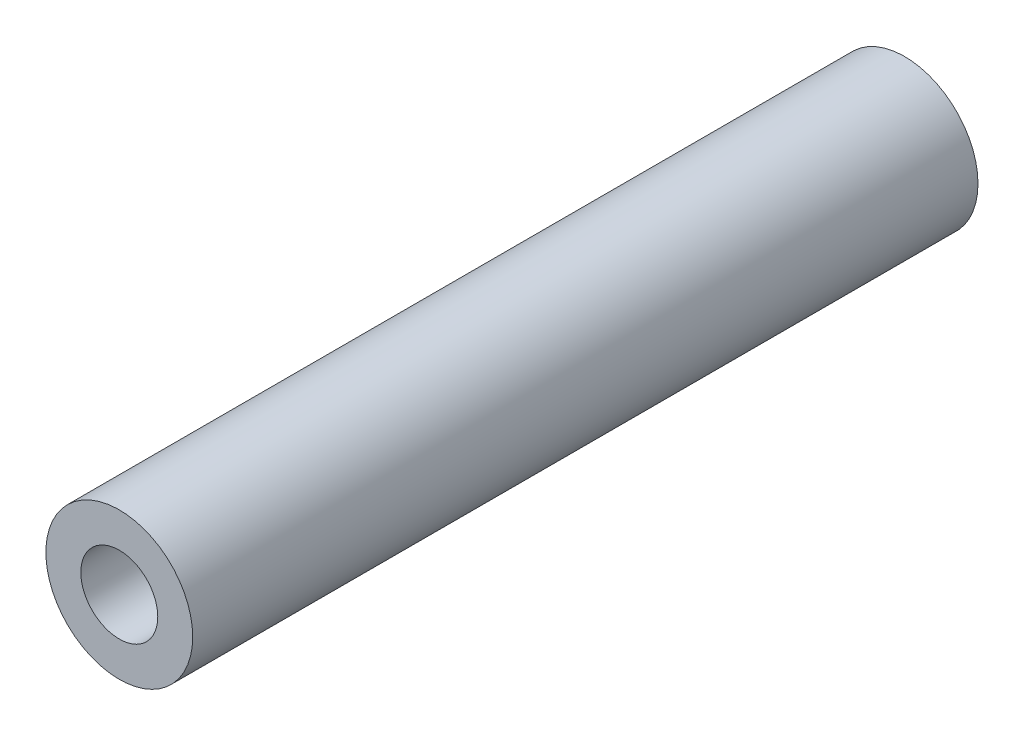
ISO-10303-21;
HEADER;
FILE_DESCRIPTION(('STEP AP214'),'2;1');
FILE_NAME('part.step','',(''),(''),'','','');
FILE_SCHEMA(('AUTOMOTIVE_DESIGN { 1 0 10303 214 1 1 1 1 }'));
ENDSEC;
DATA;
#1=APPLICATION_CONTEXT('core data for automotive mechanical design processes');
#2=APPLICATION_PROTOCOL_DEFINITION('international standard','automotive_design',2000,#1);
#3=PRODUCT_CONTEXT('',#1,'mechanical');
#4=PRODUCT('Part','Part','',(#3));
#5=PRODUCT_RELATED_PRODUCT_CATEGORY('part','',(#4));
#6=PRODUCT_DEFINITION_FORMATION('','',#4);
#7=PRODUCT_DEFINITION_CONTEXT('part definition',#1,'design');
#8=PRODUCT_DEFINITION('design','',#6,#7);
#9=PRODUCT_DEFINITION_SHAPE('','',#8);
#10=(LENGTH_UNIT() NAMED_UNIT(*) SI_UNIT(.MILLI.,.METRE.));
#11=(NAMED_UNIT(*) PLANE_ANGLE_UNIT() SI_UNIT($,.RADIAN.));
#12=(NAMED_UNIT(*) SI_UNIT($,.STERADIAN.) SOLID_ANGLE_UNIT());
#13=UNCERTAINTY_MEASURE_WITH_UNIT(LENGTH_MEASURE(1.E-05),#10,'distance_accuracy_value','');
#14=(GEOMETRIC_REPRESENTATION_CONTEXT(3) GLOBAL_UNCERTAINTY_ASSIGNED_CONTEXT((#13)) GLOBAL_UNIT_ASSIGNED_CONTEXT((#10,
#11,#12)) REPRESENTATION_CONTEXT('',''));
#15=CARTESIAN_POINT('',(0.,0.,0.));
#16=DIRECTION('',(0.,0.,1.));
#17=DIRECTION('',(1.,0.,0.));
#18=AXIS2_PLACEMENT_3D('',#15,#16,#17);
#19=CARTESIAN_POINT('',(0.,0.,-50.8));
#20=DIRECTION('',(0.,0.,-1.));
#21=DIRECTION('',(1.,0.,0.));
#22=AXIS2_PLACEMENT_3D('',#19,#20,#21);
#23=PLANE('',#22);
#24=CARTESIAN_POINT('',(0.,0.,-50.8));
#25=DIRECTION('',(0.,0.,1.));
#26=DIRECTION('',(1.,0.,0.));
#27=AXIS2_PLACEMENT_3D('',#24,#25,#26);
#28=CIRCLE('',#27,4.7498);
#29=CARTESIAN_POINT('',(4.7498,0.,-50.8));
#30=VERTEX_POINT('',#29);
#31=EDGE_CURVE('E10',#30,#30,#28,.T.);
#32=ORIENTED_EDGE('',*,*,#31,.F.);
#33=EDGE_LOOP('',(#32));
#34=FACE_BOUND('',#33,.T.);
#35=CARTESIAN_POINT('',(0.,0.,-50.8));
#36=DIRECTION('',(0.,0.,1.));
#37=DIRECTION('',(1.,0.,0.));
#38=AXIS2_PLACEMENT_3D('',#35,#36,#37);
#39=CIRCLE('',#38,2.4892);
#40=CARTESIAN_POINT('',(2.4892,0.,-50.8));
#41=VERTEX_POINT('',#40);
#42=EDGE_CURVE('E48',#41,#41,#39,.T.);
#43=ORIENTED_EDGE('',*,*,#42,.T.);
#44=EDGE_LOOP('',(#43));
#45=FACE_BOUND('',#44,.T.);
#46=ADVANCED_FACE('F37',(#34,#45),#23,.T.);
#47=CARTESIAN_POINT('',(0.,0.,0.));
#48=DIRECTION('',(0.,0.,-1.));
#49=DIRECTION('',(1.,0.,0.));
#50=AXIS2_PLACEMENT_3D('',#47,#48,#49);
#51=PLANE('',#50);
#52=CARTESIAN_POINT('',(0.,0.,0.));
#53=DIRECTION('',(0.,0.,1.));
#54=DIRECTION('',(1.,0.,0.));
#55=AXIS2_PLACEMENT_3D('',#52,#53,#54);
#56=CIRCLE('',#55,4.7498);
#57=CARTESIAN_POINT('',(4.7498,0.,0.));
#58=VERTEX_POINT('',#57);
#59=EDGE_CURVE('E41',#58,#58,#56,.T.);
#60=ORIENTED_EDGE('',*,*,#59,.T.);
#61=EDGE_LOOP('',(#60));
#62=FACE_BOUND('',#61,.T.);
#63=CARTESIAN_POINT('',(0.,0.,0.));
#64=DIRECTION('',(0.,0.,1.));
#65=DIRECTION('',(1.,0.,0.));
#66=AXIS2_PLACEMENT_3D('',#63,#64,#65);
#67=CIRCLE('',#66,2.4892);
#68=CARTESIAN_POINT('',(2.4892,0.,0.));
#69=VERTEX_POINT('',#68);
#70=EDGE_CURVE('E50',#69,#69,#67,.T.);
#71=ORIENTED_EDGE('',*,*,#70,.F.);
#72=EDGE_LOOP('',(#71));
#73=FACE_BOUND('',#72,.T.);
#74=ADVANCED_FACE('F63',(#62,#73),#51,.F.);
#75=CARTESIAN_POINT('',(0.,0.,-50.8));
#76=DIRECTION('',(0.,0.,1.));
#77=DIRECTION('',(-1.,0.,0.));
#78=AXIS2_PLACEMENT_3D('',#75,#76,#77);
#79=CYLINDRICAL_SURFACE('',#78,4.7498);
#80=ORIENTED_EDGE('',*,*,#31,.T.);
#81=EDGE_LOOP('',(#80));
#82=FACE_BOUND('',#81,.T.);
#83=ORIENTED_EDGE('',*,*,#59,.F.);
#84=EDGE_LOOP('',(#83));
#85=FACE_BOUND('',#84,.T.);
#86=ADVANCED_FACE('F39',(#82,#85),#79,.T.);
#87=CARTESIAN_POINT('',(0.,0.,-50.8));
#88=DIRECTION('',(0.,0.,1.));
#89=DIRECTION('',(-1.,0.,0.));
#90=AXIS2_PLACEMENT_3D('',#87,#88,#89);
#91=CYLINDRICAL_SURFACE('',#90,2.4892);
#92=ORIENTED_EDGE('',*,*,#42,.F.);
#93=EDGE_LOOP('',(#92));
#94=FACE_BOUND('',#93,.T.);
#95=ORIENTED_EDGE('',*,*,#70,.T.);
#96=EDGE_LOOP('',(#95));
#97=FACE_BOUND('',#96,.T.);
#98=ADVANCED_FACE('F57',(#94,#97),#91,.F.);
#99=CLOSED_SHELL('',(#46,#74,#86,#98));
#100=MANIFOLD_SOLID_BREP('B2',#99);
#101=ADVANCED_BREP_SHAPE_REPRESENTATION('',(#18,#100),#14);
#102=SHAPE_DEFINITION_REPRESENTATION(#9,#101);
ENDSEC;
END-ISO-10303-21;
